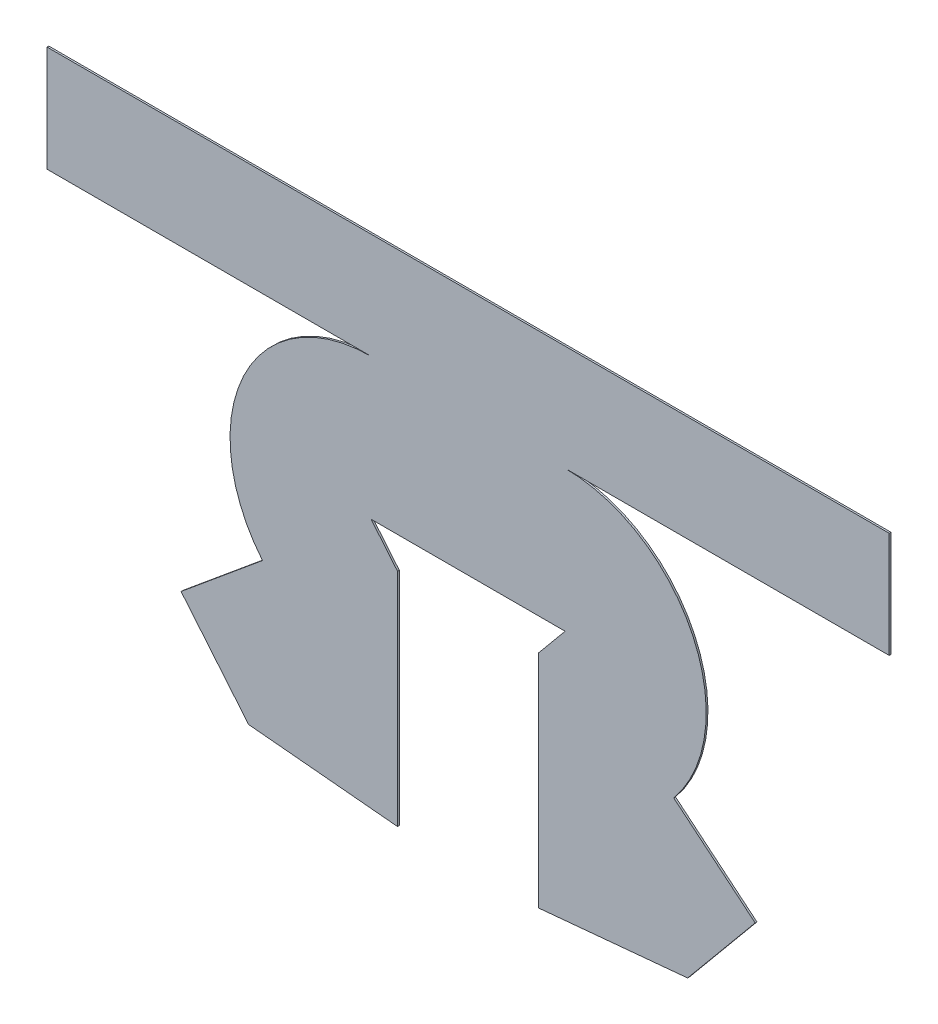
ISO-10303-21;
HEADER;
FILE_DESCRIPTION(('STEP AP214'),'2;1');
FILE_NAME('part.step','',(''),(''),'','','');
FILE_SCHEMA(('AUTOMOTIVE_DESIGN { 1 0 10303 214 1 1 1 1 }'));
ENDSEC;
DATA;
#1=APPLICATION_CONTEXT('core data for automotive mechanical design processes');
#2=APPLICATION_PROTOCOL_DEFINITION('international standard','automotive_design',2000,#1);
#3=PRODUCT_CONTEXT('',#1,'mechanical');
#4=PRODUCT('Part','Part','',(#3));
#5=PRODUCT_RELATED_PRODUCT_CATEGORY('part','',(#4));
#6=PRODUCT_DEFINITION_FORMATION('','',#4);
#7=PRODUCT_DEFINITION_CONTEXT('part definition',#1,'design');
#8=PRODUCT_DEFINITION('design','',#6,#7);
#9=PRODUCT_DEFINITION_SHAPE('','',#8);
#10=(LENGTH_UNIT() NAMED_UNIT(*) SI_UNIT(.MILLI.,.METRE.));
#11=(NAMED_UNIT(*) PLANE_ANGLE_UNIT() SI_UNIT($,.RADIAN.));
#12=(NAMED_UNIT(*) SI_UNIT($,.STERADIAN.) SOLID_ANGLE_UNIT());
#13=UNCERTAINTY_MEASURE_WITH_UNIT(LENGTH_MEASURE(1.E-05),#10,'distance_accuracy_value','');
#14=(GEOMETRIC_REPRESENTATION_CONTEXT(3) GLOBAL_UNCERTAINTY_ASSIGNED_CONTEXT((#13)) GLOBAL_UNIT_ASSIGNED_CONTEXT((#10,
#11,#12)) REPRESENTATION_CONTEXT('',''));
#15=CARTESIAN_POINT('',(0.,0.,0.));
#16=DIRECTION('',(0.,0.,1.));
#17=DIRECTION('',(1.,0.,0.));
#18=AXIS2_PLACEMENT_3D('',#15,#16,#17);
#19=CARTESIAN_POINT('',(0.,169.165015451123,2.54));
#20=DIRECTION('',(0.,1.,0.));
#21=DIRECTION('',(0.,0.,1.));
#22=AXIS2_PLACEMENT_3D('',#19,#20,#21);
#23=PLANE('',#22);
#24=DIRECTION('',(1.,0.,0.));
#25=VECTOR('',#24,1.);
#26=CARTESIAN_POINT('',(0.,169.165015451123,0.));
#27=LINE('',#26,#25);
#28=CARTESIAN_POINT('',(1.37000964085009,169.165015451123,0.));
#29=VERTEX_POINT('',#28);
#30=CARTESIAN_POINT('',(280.77000964085,169.165015451123,0.));
#31=VERTEX_POINT('',#30);
#32=EDGE_CURVE('E206',#29,#31,#27,.T.);
#33=ORIENTED_EDGE('',*,*,#32,.T.);
#34=DIRECTION('',(0.,0.,-1.));
#35=VECTOR('',#34,1.);
#36=CARTESIAN_POINT('',(280.77000964085,169.165015451123,2.54));
#37=LINE('',#36,#35);
#38=CARTESIAN_POINT('',(280.77000964085,169.165015451123,2.54));
#39=VERTEX_POINT('',#38);
#40=EDGE_CURVE('E11',#39,#31,#37,.T.);
#41=ORIENTED_EDGE('',*,*,#40,.F.);
#42=DIRECTION('',(1.,0.,0.));
#43=VECTOR('',#42,1.);
#44=CARTESIAN_POINT('',(0.,169.165015451123,2.54));
#45=LINE('',#44,#43);
#46=CARTESIAN_POINT('',(1.37000964085009,169.165015451123,2.54));
#47=VERTEX_POINT('',#46);
#48=EDGE_CURVE('E268',#47,#39,#45,.T.);
#49=ORIENTED_EDGE('',*,*,#48,.F.);
#50=DIRECTION('',(0.,0.,-1.));
#51=VECTOR('',#50,1.);
#52=CARTESIAN_POINT('',(1.37000964085009,169.165015451123,2.54));
#53=LINE('',#52,#51);
#54=EDGE_CURVE('E60',#47,#29,#53,.T.);
#55=ORIENTED_EDGE('',*,*,#54,.T.);
#56=EDGE_LOOP('',(#33,#41,#49,#55));
#57=FACE_BOUND('',#56,.T.);
#58=ADVANCED_FACE('F43',(#57),#23,.F.);
#59=CARTESIAN_POINT('',(83.2844093689419,-69.0458496524354,2.54));
#60=DIRECTION('',(0.769845478141215,-0.63823031876081,0.));
#61=DIRECTION('',(0.63823031876081,0.769845478141215,0.));
#62=AXIS2_PLACEMENT_3D('',#59,#60,#61);
#63=PLANE('',#62);
#64=DIRECTION('',(-0.63823031876081,-0.769845478141215,0.));
#65=VECTOR('',#64,1.);
#66=CARTESIAN_POINT('',(83.2844093689419,-69.0458496524354,0.));
#67=LINE('',#66,#65);
#68=CARTESIAN_POINT('',(242.67000964085,123.208075056737,0.));
#69=VERTEX_POINT('',#68);
#70=EDGE_CURVE('E209',#31,#69,#67,.T.);
#71=ORIENTED_EDGE('',*,*,#70,.T.);
#72=DIRECTION('',(0.,0.,-1.));
#73=VECTOR('',#72,1.);
#74=CARTESIAN_POINT('',(242.67000964085,123.208075056737,2.54));
#75=LINE('',#74,#73);
#76=CARTESIAN_POINT('',(242.67000964085,123.208075056737,2.54));
#77=VERTEX_POINT('',#76);
#78=EDGE_CURVE('E52',#77,#69,#75,.T.);
#79=ORIENTED_EDGE('',*,*,#78,.F.);
#80=DIRECTION('',(-0.63823031876081,-0.769845478141215,0.));
#81=VECTOR('',#80,1.);
#82=CARTESIAN_POINT('',(83.2844093689419,-69.0458496524354,2.54));
#83=LINE('',#82,#81);
#84=EDGE_CURVE('E128',#39,#77,#83,.T.);
#85=ORIENTED_EDGE('',*,*,#84,.F.);
#86=ORIENTED_EDGE('',*,*,#40,.T.);
#87=EDGE_LOOP('',(#71,#79,#85,#86));
#88=FACE_BOUND('',#87,.T.);
#89=ADVANCED_FACE('F320',(#88),#63,.F.);
#90=CARTESIAN_POINT('',(242.67000964085,0.,2.54));
#91=DIRECTION('',(-1.,0.,0.));
#92=DIRECTION('',(0.,0.,1.));
#93=AXIS2_PLACEMENT_3D('',#90,#91,#92);
#94=PLANE('',#93);
#95=DIRECTION('',(0.,1.,0.));
#96=VECTOR('',#95,1.);
#97=CARTESIAN_POINT('',(242.67000964085,0.,0.));
#98=LINE('',#97,#96);
#99=CARTESIAN_POINT('',(242.67000964085,-195.172287058516,0.));
#100=VERTEX_POINT('',#99);
#101=EDGE_CURVE('E213',#100,#69,#98,.T.);
#102=ORIENTED_EDGE('',*,*,#101,.F.);
#103=DIRECTION('',(0.,0.,-1.));
#104=VECTOR('',#103,1.);
#105=CARTESIAN_POINT('',(242.67000964085,-195.172287058516,2.54));
#106=LINE('',#105,#104);
#107=CARTESIAN_POINT('',(242.67000964085,-195.172287058516,2.54));
#108=VERTEX_POINT('',#107);
#109=EDGE_CURVE('E311',#108,#100,#106,.T.);
#110=ORIENTED_EDGE('',*,*,#109,.F.);
#111=DIRECTION('',(0.,1.,0.));
#112=VECTOR('',#111,1.);
#113=CARTESIAN_POINT('',(242.67000964085,0.,2.54));
#114=LINE('',#113,#112);
#115=EDGE_CURVE('E319',#108,#77,#114,.T.);
#116=ORIENTED_EDGE('',*,*,#115,.T.);
#117=ORIENTED_EDGE('',*,*,#78,.T.);
#118=EDGE_LOOP('',(#102,#110,#116,#117));
#119=FACE_BOUND('',#118,.T.);
#120=ADVANCED_FACE('F317',(#119),#94,.T.);
#121=CARTESIAN_POINT('',(20.1868979250515,-215.96814923607,2.54));
#122=DIRECTION('',(0.0930659717048337,-0.995659944414073,0.));
#123=DIRECTION('',(0.995659944414073,0.0930659717048337,0.));
#124=AXIS2_PLACEMENT_3D('',#121,#122,#123);
#125=PLANE('',#124);
#126=DIRECTION('',(-0.995659944414073,-0.0930659717048337,0.));
#127=VECTOR('',#126,1.);
#128=CARTESIAN_POINT('',(20.1868979250515,-215.96814923607,0.));
#129=LINE('',#128,#127);
#130=CARTESIAN_POINT('',(457.26076108872,-175.114136768942,0.));
#131=VERTEX_POINT('',#130);
#132=EDGE_CURVE('E217',#131,#100,#129,.T.);
#133=ORIENTED_EDGE('',*,*,#132,.F.);
#134=DIRECTION('',(0.,0.,-1.));
#135=VECTOR('',#134,1.);
#136=CARTESIAN_POINT('',(457.26076108872,-175.114136768942,2.54));
#137=LINE('',#136,#135);
#138=CARTESIAN_POINT('',(457.26076108872,-175.114136768942,2.54));
#139=VERTEX_POINT('',#138);
#140=EDGE_CURVE('E308',#139,#131,#137,.T.);
#141=ORIENTED_EDGE('',*,*,#140,.F.);
#142=DIRECTION('',(-0.995659944414073,-0.0930659717048337,0.));
#143=VECTOR('',#142,1.);
#144=CARTESIAN_POINT('',(20.1868979250515,-215.96814923607,2.54));
#145=LINE('',#144,#143);
#146=EDGE_CURVE('E331',#139,#108,#145,.T.);
#147=ORIENTED_EDGE('',*,*,#146,.T.);
#148=ORIENTED_EDGE('',*,*,#109,.T.);
#149=EDGE_LOOP('',(#133,#141,#147,#148));
#150=FACE_BOUND('',#149,.T.);
#151=ADVANCED_FACE('F328',(#150),#125,.T.);
#152=CARTESIAN_POINT('',(357.04146139596,-296.000551003779,2.54));
#153=DIRECTION('',(0.769845478141217,-0.638230318760807,0.));
#154=DIRECTION('',(0.638230318760807,0.769845478141217,0.));
#155=AXIS2_PLACEMENT_3D('',#152,#153,#154);
#156=PLANE('',#155);
#157=DIRECTION('',(-0.638230318760807,-0.769845478141217,0.));
#158=VECTOR('',#157,1.);
#159=CARTESIAN_POINT('',(357.04146139596,-296.000551003779,0.));
#160=LINE('',#159,#158);
#161=CARTESIAN_POINT('',(554.527061667866,-57.789685900221,0.));
#162=VERTEX_POINT('',#161);
#163=EDGE_CURVE('E221',#162,#131,#160,.T.);
#164=ORIENTED_EDGE('',*,*,#163,.F.);
#165=DIRECTION('',(0.,0.,-1.));
#166=VECTOR('',#165,1.);
#167=CARTESIAN_POINT('',(554.527061667866,-57.789685900221,2.54));
#168=LINE('',#167,#166);
#169=CARTESIAN_POINT('',(554.527061667866,-57.789685900221,2.54));
#170=VERTEX_POINT('',#169);
#171=EDGE_CURVE('E305',#170,#162,#168,.T.);
#172=ORIENTED_EDGE('',*,*,#171,.F.);
#173=DIRECTION('',(-0.638230318760807,-0.769845478141217,0.));
#174=VECTOR('',#173,1.);
#175=CARTESIAN_POINT('',(357.04146139596,-296.000551003779,2.54));
#176=LINE('',#175,#174);
#177=EDGE_CURVE('E338',#170,#139,#176,.T.);
#178=ORIENTED_EDGE('',*,*,#177,.T.);
#179=ORIENTED_EDGE('',*,*,#140,.T.);
#180=EDGE_LOOP('',(#164,#172,#178,#179));
#181=FACE_BOUND('',#180,.T.);
#182=ADVANCED_FACE('F416',(#181),#156,.T.);
#183=CARTESIAN_POINT('',(197.485600271907,238.210865103558,2.54));
#184=DIRECTION('',(-0.638230318760807,-0.769845478141217,0.));
#185=DIRECTION('',(0.769845478141217,-0.638230318760807,0.));
#186=AXIS2_PLACEMENT_3D('',#183,#184,#185);
#187=PLANE('',#186);
#188=DIRECTION('',(-0.769845478141217,0.638230318760807,0.));
#189=VECTOR('',#188,1.);
#190=CARTESIAN_POINT('',(197.485600271907,238.210865103558,0.));
#191=LINE('',#190,#189);
#192=CARTESIAN_POINT('',(437.202610799145,39.476614678926,0.));
#193=VERTEX_POINT('',#192);
#194=EDGE_CURVE('E225',#162,#193,#191,.T.);
#195=ORIENTED_EDGE('',*,*,#194,.T.);
#196=DIRECTION('',(0.,0.,-1.));
#197=VECTOR('',#196,1.);
#198=CARTESIAN_POINT('',(437.202610799145,39.476614678926,2.54));
#199=LINE('',#198,#197);
#200=CARTESIAN_POINT('',(437.202610799145,39.476614678926,2.54));
#201=VERTEX_POINT('',#200);
#202=EDGE_CURVE('E302',#201,#193,#199,.T.);
#203=ORIENTED_EDGE('',*,*,#202,.F.);
#204=DIRECTION('',(-0.769845478141217,0.638230318760807,0.));
#205=VECTOR('',#204,1.);
#206=CARTESIAN_POINT('',(197.485600271907,238.210865103558,2.54));
#207=LINE('',#206,#205);
#208=EDGE_CURVE('E345',#170,#201,#207,.T.);
#209=ORIENTED_EDGE('',*,*,#208,.F.);
#210=ORIENTED_EDGE('',*,*,#171,.T.);
#211=EDGE_LOOP('',(#195,#203,#209,#210));
#212=FACE_BOUND('',#211,.T.);
#213=ADVANCED_FACE('F419',(#212),#187,.F.);
#214=CARTESIAN_POINT('',(280.77000964085,169.165015451123,2.54));
#215=DIRECTION('',(0.,0.,-1.));
#216=DIRECTION('',(-1.,0.,0.));
#217=AXIS2_PLACEMENT_3D('',#214,#215,#216);
#218=CYLINDRICAL_SURFACE('',#217,203.2);
#219=CARTESIAN_POINT('',(280.77000964085,169.165015451123,0.));
#220=DIRECTION('',(0.,0.,1.));
#221=DIRECTION('',(1.,0.,0.));
#222=AXIS2_PLACEMENT_3D('',#219,#220,#221);
#223=CIRCLE('',#222,203.2);
#224=CARTESIAN_POINT('',(280.770009640851,372.365015451122,0.));
#225=VERTEX_POINT('',#224);
#226=EDGE_CURVE('E229',#225,#193,#223,.F.);
#227=ORIENTED_EDGE('',*,*,#226,.F.);
#228=DIRECTION('',(0.,0.,-1.));
#229=VECTOR('',#228,1.);
#230=CARTESIAN_POINT('',(280.770009640851,372.365015451122,2.54));
#231=LINE('',#230,#229);
#232=CARTESIAN_POINT('',(280.770009640851,372.365015451122,2.54));
#233=VERTEX_POINT('',#232);
#234=EDGE_CURVE('E299',#233,#225,#231,.T.);
#235=ORIENTED_EDGE('',*,*,#234,.F.);
#236=CARTESIAN_POINT('',(280.77000964085,169.165015451123,2.54));
#237=DIRECTION('',(0.,0.,1.));
#238=DIRECTION('',(1.,0.,0.));
#239=AXIS2_PLACEMENT_3D('',#236,#237,#238);
#240=CIRCLE('',#239,203.2);
#241=EDGE_CURVE('E348',#233,#201,#240,.F.);
#242=ORIENTED_EDGE('',*,*,#241,.T.);
#243=ORIENTED_EDGE('',*,*,#202,.T.);
#244=EDGE_LOOP('',(#227,#235,#242,#243));
#245=FACE_BOUND('',#244,.T.);
#246=ADVANCED_FACE('F423',(#245),#218,.T.);
#247=CARTESIAN_POINT('',(0.,372.365015451122,2.54));
#248=DIRECTION('',(0.,1.,0.));
#249=DIRECTION('',(0.,0.,1.));
#250=AXIS2_PLACEMENT_3D('',#247,#248,#249);
#251=PLANE('',#250);
#252=DIRECTION('',(1.,0.,0.));
#253=VECTOR('',#252,1.);
#254=CARTESIAN_POINT('',(0.,372.365015451122,0.));
#255=LINE('',#254,#253);
#256=CARTESIAN_POINT('',(747.609563640851,372.365015451122,0.));
#257=VERTEX_POINT('',#256);
#258=EDGE_CURVE('E233',#225,#257,#255,.T.);
#259=ORIENTED_EDGE('',*,*,#258,.T.);
#260=DIRECTION('',(0.,0.,-1.));
#261=VECTOR('',#260,1.);
#262=CARTESIAN_POINT('',(747.609563640851,372.365015451122,2.54));
#263=LINE('',#262,#261);
#264=CARTESIAN_POINT('',(747.609563640851,372.365015451122,2.54));
#265=VERTEX_POINT('',#264);
#266=EDGE_CURVE('E295',#265,#257,#263,.T.);
#267=ORIENTED_EDGE('',*,*,#266,.F.);
#268=DIRECTION('',(1.,0.,0.));
#269=VECTOR('',#268,1.);
#270=CARTESIAN_POINT('',(0.,372.365015451122,2.54));
#271=LINE('',#270,#269);
#272=EDGE_CURVE('E352',#233,#265,#271,.T.);
#273=ORIENTED_EDGE('',*,*,#272,.F.);
#274=ORIENTED_EDGE('',*,*,#234,.T.);
#275=EDGE_LOOP('',(#259,#267,#273,#274));
#276=FACE_BOUND('',#275,.T.);
#277=ADVANCED_FACE('F427',(#276),#251,.F.);
#278=CARTESIAN_POINT('',(747.609563640851,0.,2.54));
#279=DIRECTION('',(-1.,0.,0.));
#280=DIRECTION('',(0.,0.,1.));
#281=AXIS2_PLACEMENT_3D('',#278,#279,#280);
#282=PLANE('',#281);
#283=DIRECTION('',(0.,1.,0.));
#284=VECTOR('',#283,1.);
#285=CARTESIAN_POINT('',(747.609563640851,0.,0.));
#286=LINE('',#285,#284);
#287=CARTESIAN_POINT('',(747.609563640851,524.765015451123,0.));
#288=VERTEX_POINT('',#287);
#289=EDGE_CURVE('E236',#257,#288,#286,.T.);
#290=ORIENTED_EDGE('',*,*,#289,.T.);
#291=DIRECTION('',(0.,0.,-1.));
#292=VECTOR('',#291,1.);
#293=CARTESIAN_POINT('',(747.609563640851,524.765015451123,2.54));
#294=LINE('',#293,#292);
#295=CARTESIAN_POINT('',(747.609563640851,524.765015451123,2.54));
#296=VERTEX_POINT('',#295);
#297=EDGE_CURVE('E292',#296,#288,#294,.T.);
#298=ORIENTED_EDGE('',*,*,#297,.F.);
#299=DIRECTION('',(0.,1.,0.));
#300=VECTOR('',#299,1.);
#301=CARTESIAN_POINT('',(747.609563640851,0.,2.54));
#302=LINE('',#301,#300);
#303=EDGE_CURVE('E355',#265,#296,#302,.T.);
#304=ORIENTED_EDGE('',*,*,#303,.F.);
#305=ORIENTED_EDGE('',*,*,#266,.T.);
#306=EDGE_LOOP('',(#290,#298,#304,#305));
#307=FACE_BOUND('',#306,.T.);
#308=ADVANCED_FACE('F429',(#307),#282,.F.);
#309=CARTESIAN_POINT('',(0.,524.765015451123,2.54));
#310=DIRECTION('',(0.,1.,0.));
#311=DIRECTION('',(0.,0.,1.));
#312=AXIS2_PLACEMENT_3D('',#309,#310,#311);
#313=PLANE('',#312);
#314=DIRECTION('',(1.,0.,0.));
#315=VECTOR('',#314,1.);
#316=CARTESIAN_POINT('',(0.,524.765015451123,0.));
#317=LINE('',#316,#315);
#318=CARTESIAN_POINT('',(-465.469544359149,524.765015451123,0.));
#319=VERTEX_POINT('',#318);
#320=EDGE_CURVE('E241',#319,#288,#317,.T.);
#321=ORIENTED_EDGE('',*,*,#320,.F.);
#322=DIRECTION('',(0.,0.,-1.));
#323=VECTOR('',#322,1.);
#324=CARTESIAN_POINT('',(-465.469544359149,524.765015451123,2.54));
#325=LINE('',#324,#323);
#326=CARTESIAN_POINT('',(-465.469544359149,524.765015451123,2.54));
#327=VERTEX_POINT('',#326);
#328=EDGE_CURVE('E289',#327,#319,#325,.T.);
#329=ORIENTED_EDGE('',*,*,#328,.F.);
#330=DIRECTION('',(1.,0.,0.));
#331=VECTOR('',#330,1.);
#332=CARTESIAN_POINT('',(0.,524.765015451123,2.54));
#333=LINE('',#332,#331);
#334=EDGE_CURVE('E359',#327,#296,#333,.T.);
#335=ORIENTED_EDGE('',*,*,#334,.T.);
#336=ORIENTED_EDGE('',*,*,#297,.T.);
#337=EDGE_LOOP('',(#321,#329,#335,#336));
#338=FACE_BOUND('',#337,.T.);
#339=ADVANCED_FACE('F432',(#338),#313,.T.);
#340=CARTESIAN_POINT('',(-465.469544359149,0.,2.54));
#341=DIRECTION('',(1.,0.,0.));
#342=DIRECTION('',(0.,0.,-1.));
#343=AXIS2_PLACEMENT_3D('',#340,#341,#342);
#344=PLANE('',#343);
#345=DIRECTION('',(0.,-1.,0.));
#346=VECTOR('',#345,1.);
#347=CARTESIAN_POINT('',(-465.469544359149,0.,0.));
#348=LINE('',#347,#346);
#349=CARTESIAN_POINT('',(-465.469544359149,372.365015451122,0.));
#350=VERTEX_POINT('',#349);
#351=EDGE_CURVE('E245',#319,#350,#348,.T.);
#352=ORIENTED_EDGE('',*,*,#351,.T.);
#353=DIRECTION('',(0.,0.,-1.));
#354=VECTOR('',#353,1.);
#355=CARTESIAN_POINT('',(-465.469544359149,372.365015451122,2.54));
#356=LINE('',#355,#354);
#357=CARTESIAN_POINT('',(-465.469544359149,372.365015451122,2.54));
#358=VERTEX_POINT('',#357);
#359=EDGE_CURVE('E285',#358,#350,#356,.T.);
#360=ORIENTED_EDGE('',*,*,#359,.F.);
#361=DIRECTION('',(0.,-1.,0.));
#362=VECTOR('',#361,1.);
#363=CARTESIAN_POINT('',(-465.469544359149,0.,2.54));
#364=LINE('',#363,#362);
#365=EDGE_CURVE('E363',#327,#358,#364,.T.);
#366=ORIENTED_EDGE('',*,*,#365,.F.);
#367=ORIENTED_EDGE('',*,*,#328,.T.);
#368=EDGE_LOOP('',(#352,#360,#366,#367));
#369=FACE_BOUND('',#368,.T.);
#370=ADVANCED_FACE('F436',(#369),#344,.F.);
#371=CARTESIAN_POINT('',(1.3700096408508,372.365015451122,0.));
#372=VERTEX_POINT('',#371);
#373=EDGE_CURVE('E237',#350,#372,#255,.T.);
#374=ORIENTED_EDGE('',*,*,#373,.T.);
#375=DIRECTION('',(0.,0.,-1.));
#376=VECTOR('',#375,1.);
#377=CARTESIAN_POINT('',(1.3700096408508,372.365015451122,2.54));
#378=LINE('',#377,#376);
#379=CARTESIAN_POINT('',(1.3700096408508,372.365015451122,2.54));
#380=VERTEX_POINT('',#379);
#381=EDGE_CURVE('E281',#380,#372,#378,.T.);
#382=ORIENTED_EDGE('',*,*,#381,.F.);
#383=EDGE_CURVE('E356',#358,#380,#271,.T.);
#384=ORIENTED_EDGE('',*,*,#383,.F.);
#385=ORIENTED_EDGE('',*,*,#359,.T.);
#386=EDGE_LOOP('',(#374,#382,#384,#385));
#387=FACE_BOUND('',#386,.T.);
#388=ADVANCED_FACE('F382',(#387),#251,.F.);
#389=CARTESIAN_POINT('',(1.3700096408501,169.165015451123,2.54));
#390=DIRECTION('',(0.,0.,-1.));
#391=DIRECTION('',(-1.,0.,0.));
#392=AXIS2_PLACEMENT_3D('',#389,#390,#391);
#393=CYLINDRICAL_SURFACE('',#392,203.2);
#394=CARTESIAN_POINT('',(1.3700096408501,169.165015451123,0.));
#395=DIRECTION('',(0.,0.,1.));
#396=DIRECTION('',(1.,0.,0.));
#397=AXIS2_PLACEMENT_3D('',#394,#395,#396);
#398=CIRCLE('',#397,203.2);
#399=CARTESIAN_POINT('',(-155.062591517445,39.476614678926,0.));
#400=VERTEX_POINT('',#399);
#401=EDGE_CURVE('E248',#372,#400,#398,.T.);
#402=ORIENTED_EDGE('',*,*,#401,.T.);
#403=DIRECTION('',(0.,0.,-1.));
#404=VECTOR('',#403,1.);
#405=CARTESIAN_POINT('',(-155.062591517445,39.476614678926,2.54));
#406=LINE('',#405,#404);
#407=CARTESIAN_POINT('',(-155.062591517445,39.476614678926,2.54));
#408=VERTEX_POINT('',#407);
#409=EDGE_CURVE('E278',#408,#400,#406,.T.);
#410=ORIENTED_EDGE('',*,*,#409,.F.);
#411=CARTESIAN_POINT('',(1.3700096408501,169.165015451123,2.54));
#412=DIRECTION('',(0.,0.,1.));
#413=DIRECTION('',(1.,0.,0.));
#414=AXIS2_PLACEMENT_3D('',#411,#412,#413);
#415=CIRCLE('',#414,203.2);
#416=EDGE_CURVE('E366',#380,#408,#415,.T.);
#417=ORIENTED_EDGE('',*,*,#416,.F.);
#418=ORIENTED_EDGE('',*,*,#381,.T.);
#419=EDGE_LOOP('',(#402,#410,#417,#418));
#420=FACE_BOUND('',#419,.T.);
#421=ADVANCED_FACE('F386',(#420),#393,.T.);
#422=CARTESIAN_POINT('',(-82.5592660866518,99.5845477834253,2.54));
#423=DIRECTION('',(-0.638230318760807,0.769845478141217,0.));
#424=DIRECTION('',(-0.769845478141217,-0.638230318760807,0.));
#425=AXIS2_PLACEMENT_3D('',#422,#423,#424);
#426=PLANE('',#425);
#427=DIRECTION('',(0.769845478141217,0.638230318760807,0.));
#428=VECTOR('',#427,1.);
#429=CARTESIAN_POINT('',(-82.5592660866518,99.5845477834253,0.));
#430=LINE('',#429,#428);
#431=CARTESIAN_POINT('',(-272.387042386166,-57.789685900221,0.));
#432=VERTEX_POINT('',#431);
#433=EDGE_CURVE('E252',#432,#400,#430,.T.);
#434=ORIENTED_EDGE('',*,*,#433,.F.);
#435=DIRECTION('',(0.,0.,-1.));
#436=VECTOR('',#435,1.);
#437=CARTESIAN_POINT('',(-272.387042386166,-57.789685900221,2.54));
#438=LINE('',#437,#436);
#439=CARTESIAN_POINT('',(-272.387042386166,-57.789685900221,2.54));
#440=VERTEX_POINT('',#439);
#441=EDGE_CURVE('E275',#440,#432,#438,.T.);
#442=ORIENTED_EDGE('',*,*,#441,.F.);
#443=DIRECTION('',(0.769845478141217,0.638230318760807,0.));
#444=VECTOR('',#443,1.);
#445=CARTESIAN_POINT('',(-82.5592660866518,99.5845477834253,2.54));
#446=LINE('',#445,#444);
#447=EDGE_CURVE('E369',#440,#408,#446,.T.);
#448=ORIENTED_EDGE('',*,*,#447,.T.);
#449=ORIENTED_EDGE('',*,*,#409,.T.);
#450=EDGE_LOOP('',(#434,#442,#448,#449));
#451=FACE_BOUND('',#450,.T.);
#452=ADVANCED_FACE('F389',(#451),#426,.T.);
#453=CARTESIAN_POINT('',(-189.827776299514,-157.374233683646,2.54));
#454=DIRECTION('',(0.769845478141217,0.638230318760807,0.));
#455=DIRECTION('',(-0.638230318760807,0.769845478141217,0.));
#456=AXIS2_PLACEMENT_3D('',#453,#454,#455);
#457=PLANE('',#456);
#458=DIRECTION('',(0.638230318760807,-0.769845478141217,0.));
#459=VECTOR('',#458,1.);
#460=CARTESIAN_POINT('',(-189.827776299514,-157.374233683646,0.));
#461=LINE('',#460,#459);
#462=CARTESIAN_POINT('',(-175.120741807019,-175.114136768942,0.));
#463=VERTEX_POINT('',#462);
#464=EDGE_CURVE('E256',#432,#463,#461,.T.);
#465=ORIENTED_EDGE('',*,*,#464,.T.);
#466=DIRECTION('',(0.,0.,-1.));
#467=VECTOR('',#466,1.);
#468=CARTESIAN_POINT('',(-175.120741807019,-175.114136768942,2.54));
#469=LINE('',#468,#467);
#470=CARTESIAN_POINT('',(-175.120741807019,-175.114136768942,2.54));
#471=VERTEX_POINT('',#470);
#472=EDGE_CURVE('E196',#471,#463,#469,.T.);
#473=ORIENTED_EDGE('',*,*,#472,.F.);
#474=DIRECTION('',(0.638230318760807,-0.769845478141217,0.));
#475=VECTOR('',#474,1.);
#476=CARTESIAN_POINT('',(-189.827776299514,-157.374233683646,2.54));
#477=LINE('',#476,#475);
#478=EDGE_CURVE('E182',#440,#471,#477,.T.);
#479=ORIENTED_EDGE('',*,*,#478,.F.);
#480=ORIENTED_EDGE('',*,*,#441,.T.);
#481=EDGE_LOOP('',(#465,#473,#479,#480));
#482=FACE_BOUND('',#481,.T.);
#483=ADVANCED_FACE('F392',(#482),#457,.F.);
#484=CARTESIAN_POINT('',(-17.7432056043341,-189.824473780476,2.54));
#485=DIRECTION('',(0.093065971704834,0.995659944414073,0.));
#486=DIRECTION('',(-0.995659944414073,0.093065971704834,0.));
#487=AXIS2_PLACEMENT_3D('',#484,#485,#486);
#488=PLANE('',#487);
#489=DIRECTION('',(0.995659944414073,-0.093065971704834,0.));
#490=VECTOR('',#489,1.);
#491=CARTESIAN_POINT('',(-17.7432056043341,-189.824473780476,0.));
#492=LINE('',#491,#490);
#493=CARTESIAN_POINT('',(39.4700096408501,-195.172287058516,0.));
#494=VERTEX_POINT('',#493);
#495=EDGE_CURVE('E192',#463,#494,#492,.T.);
#496=ORIENTED_EDGE('',*,*,#495,.T.);
#497=DIRECTION('',(0.,0.,-1.));
#498=VECTOR('',#497,1.);
#499=CARTESIAN_POINT('',(39.4700096408501,-195.172287058516,2.54));
#500=LINE('',#499,#498);
#501=CARTESIAN_POINT('',(39.4700096408501,-195.172287058516,2.54));
#502=VERTEX_POINT('',#501);
#503=EDGE_CURVE('E189',#502,#494,#500,.T.);
#504=ORIENTED_EDGE('',*,*,#503,.F.);
#505=DIRECTION('',(0.995659944414073,-0.093065971704834,0.));
#506=VECTOR('',#505,1.);
#507=CARTESIAN_POINT('',(-17.7432056043341,-189.824473780476,2.54));
#508=LINE('',#507,#506);
#509=EDGE_CURVE('E174',#471,#502,#508,.T.);
#510=ORIENTED_EDGE('',*,*,#509,.F.);
#511=ORIENTED_EDGE('',*,*,#472,.T.);
#512=EDGE_LOOP('',(#496,#504,#510,#511));
#513=FACE_BOUND('',#512,.T.);
#514=ADVANCED_FACE('F190',(#513),#488,.F.);
#515=CARTESIAN_POINT('',(39.4700096408501,0.,2.54));
#516=DIRECTION('',(1.,0.,0.));
#517=DIRECTION('',(0.,0.,-1.));
#518=AXIS2_PLACEMENT_3D('',#515,#516,#517);
#519=PLANE('',#518);
#520=DIRECTION('',(0.,-1.,0.));
#521=VECTOR('',#520,1.);
#522=CARTESIAN_POINT('',(39.4700096408501,0.,0.));
#523=LINE('',#522,#521);
#524=CARTESIAN_POINT('',(39.4700096408501,123.208075056737,0.));
#525=VERTEX_POINT('',#524);
#526=EDGE_CURVE('E261',#525,#494,#523,.T.);
#527=ORIENTED_EDGE('',*,*,#526,.F.);
#528=DIRECTION('',(0.,0.,-1.));
#529=VECTOR('',#528,1.);
#530=CARTESIAN_POINT('',(39.4700096408501,123.208075056737,2.54));
#531=LINE('',#530,#529);
#532=CARTESIAN_POINT('',(39.4700096408501,123.208075056737,2.54));
#533=VERTEX_POINT('',#532);
#534=EDGE_CURVE('E116',#533,#525,#531,.T.);
#535=ORIENTED_EDGE('',*,*,#534,.F.);
#536=DIRECTION('',(0.,-1.,0.));
#537=VECTOR('',#536,1.);
#538=CARTESIAN_POINT('',(39.4700096408501,0.,2.54));
#539=LINE('',#538,#537);
#540=EDGE_CURVE('E179',#533,#502,#539,.T.);
#541=ORIENTED_EDGE('',*,*,#540,.T.);
#542=ORIENTED_EDGE('',*,*,#503,.T.);
#543=EDGE_LOOP('',(#527,#535,#541,#542));
#544=FACE_BOUND('',#543,.T.);
#545=ADVANCED_FACE('F198',(#544),#519,.T.);
#546=CARTESIAN_POINT('',(83.9292757275024,69.5804676676973,2.54));
#547=DIRECTION('',(0.769845478141215,0.63823031876081,0.));
#548=DIRECTION('',(-0.63823031876081,0.769845478141215,0.));
#549=AXIS2_PLACEMENT_3D('',#546,#547,#548);
#550=PLANE('',#549);
#551=DIRECTION('',(0.63823031876081,-0.769845478141215,0.));
#552=VECTOR('',#551,1.);
#553=CARTESIAN_POINT('',(83.9292757275024,69.5804676676973,0.));
#554=LINE('',#553,#552);
#555=EDGE_CURVE('E264',#29,#525,#554,.T.);
#556=ORIENTED_EDGE('',*,*,#555,.F.);
#557=ORIENTED_EDGE('',*,*,#54,.F.);
#558=DIRECTION('',(0.63823031876081,-0.769845478141215,0.));
#559=VECTOR('',#558,1.);
#560=CARTESIAN_POINT('',(83.9292757275024,69.5804676676973,2.54));
#561=LINE('',#560,#559);
#562=EDGE_CURVE('E200',#47,#533,#561,.T.);
#563=ORIENTED_EDGE('',*,*,#562,.T.);
#564=ORIENTED_EDGE('',*,*,#534,.T.);
#565=EDGE_LOOP('',(#556,#557,#563,#564));
#566=FACE_BOUND('',#565,.T.);
#567=ADVANCED_FACE('F393',(#566),#550,.T.);
#568=CARTESIAN_POINT('',(0.,0.,2.54));
#569=DIRECTION('',(0.,0.,1.));
#570=DIRECTION('',(1.,0.,0.));
#571=AXIS2_PLACEMENT_3D('',#568,#569,#570);
#572=PLANE('',#571);
#573=ORIENTED_EDGE('',*,*,#48,.T.);
#574=ORIENTED_EDGE('',*,*,#84,.T.);
#575=ORIENTED_EDGE('',*,*,#115,.F.);
#576=ORIENTED_EDGE('',*,*,#146,.F.);
#577=ORIENTED_EDGE('',*,*,#177,.F.);
#578=ORIENTED_EDGE('',*,*,#208,.T.);
#579=ORIENTED_EDGE('',*,*,#241,.F.);
#580=ORIENTED_EDGE('',*,*,#272,.T.);
#581=ORIENTED_EDGE('',*,*,#303,.T.);
#582=ORIENTED_EDGE('',*,*,#334,.F.);
#583=ORIENTED_EDGE('',*,*,#365,.T.);
#584=ORIENTED_EDGE('',*,*,#383,.T.);
#585=ORIENTED_EDGE('',*,*,#416,.T.);
#586=ORIENTED_EDGE('',*,*,#447,.F.);
#587=ORIENTED_EDGE('',*,*,#478,.T.);
#588=ORIENTED_EDGE('',*,*,#509,.T.);
#589=ORIENTED_EDGE('',*,*,#540,.F.);
#590=ORIENTED_EDGE('',*,*,#562,.F.);
#591=EDGE_LOOP('',(#573,#574,#575,#576,#577,#578,#579,#580,#581,#582,#583,#584,#585,#586,#587,
#588,#589,#590));
#592=FACE_BOUND('',#591,.T.);
#593=ADVANCED_FACE('F176',(#592),#572,.T.);
#594=CARTESIAN_POINT('',(0.,0.,0.));
#595=DIRECTION('',(0.,0.,1.));
#596=DIRECTION('',(1.,0.,0.));
#597=AXIS2_PLACEMENT_3D('',#594,#595,#596);
#598=PLANE('',#597);
#599=ORIENTED_EDGE('',*,*,#32,.F.);
#600=ORIENTED_EDGE('',*,*,#555,.T.);
#601=ORIENTED_EDGE('',*,*,#526,.T.);
#602=ORIENTED_EDGE('',*,*,#495,.F.);
#603=ORIENTED_EDGE('',*,*,#464,.F.);
#604=ORIENTED_EDGE('',*,*,#433,.T.);
#605=ORIENTED_EDGE('',*,*,#401,.F.);
#606=ORIENTED_EDGE('',*,*,#373,.F.);
#607=ORIENTED_EDGE('',*,*,#351,.F.);
#608=ORIENTED_EDGE('',*,*,#320,.T.);
#609=ORIENTED_EDGE('',*,*,#289,.F.);
#610=ORIENTED_EDGE('',*,*,#258,.F.);
#611=ORIENTED_EDGE('',*,*,#226,.T.);
#612=ORIENTED_EDGE('',*,*,#194,.F.);
#613=ORIENTED_EDGE('',*,*,#163,.T.);
#614=ORIENTED_EDGE('',*,*,#132,.T.);
#615=ORIENTED_EDGE('',*,*,#101,.T.);
#616=ORIENTED_EDGE('',*,*,#70,.F.);
#617=EDGE_LOOP('',(#599,#600,#601,#602,#603,#604,#605,#606,#607,#608,#609,#610,#611,#612,#613,
#614,#615,#616));
#618=FACE_BOUND('',#617,.T.);
#619=ADVANCED_FACE('F323',(#618),#598,.F.);
#620=CLOSED_SHELL('',(#58,#89,#120,#151,#182,#213,#246,#277,#308,#339,#370,#388,#421,#452,#483,
#514,#545,#567,#593,#619));
#621=MANIFOLD_SOLID_BREP('B2',#620);
#622=ADVANCED_BREP_SHAPE_REPRESENTATION('',(#18,#621),#14);
#623=SHAPE_DEFINITION_REPRESENTATION(#9,#622);
ENDSEC;
END-ISO-10303-21;
